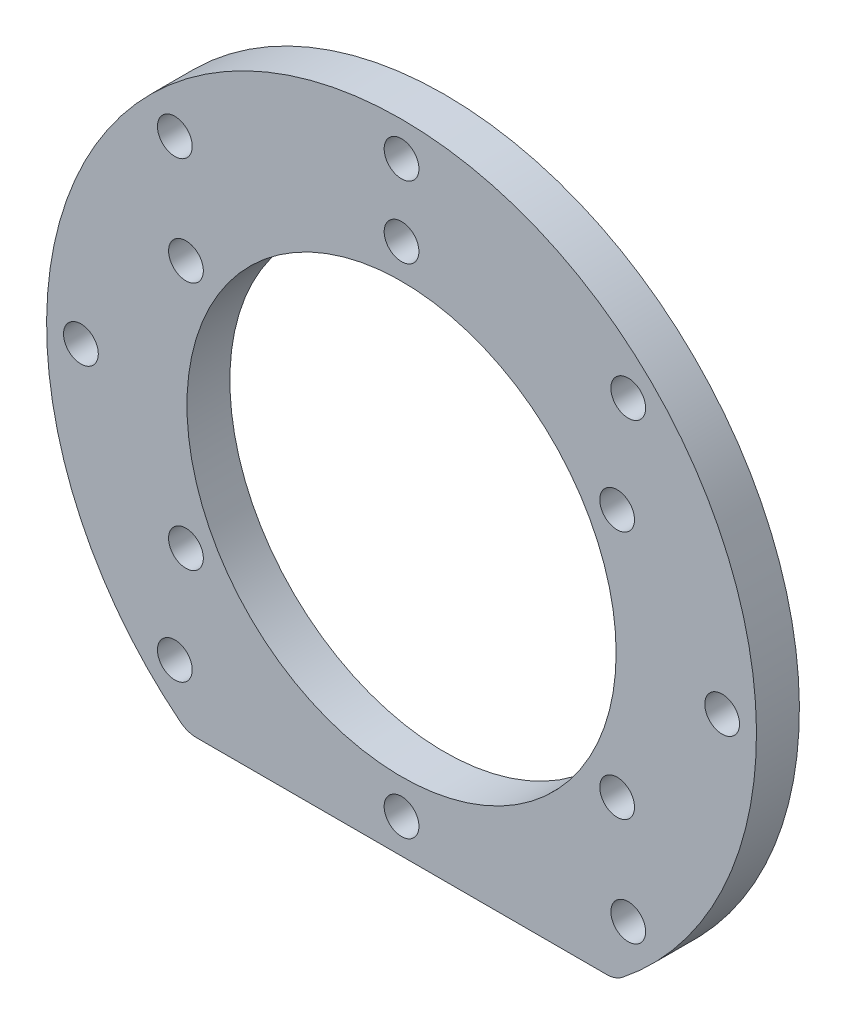
ISO-10303-21;
HEADER;
FILE_DESCRIPTION(('STEP AP214'),'2;1');
FILE_NAME('part.step','',(''),(''),'','','');
FILE_SCHEMA(('AUTOMOTIVE_DESIGN { 1 0 10303 214 1 1 1 1 }'));
ENDSEC;
DATA;
#1=APPLICATION_CONTEXT('core data for automotive mechanical design processes');
#2=APPLICATION_PROTOCOL_DEFINITION('international standard','automotive_design',2000,#1);
#3=PRODUCT_CONTEXT('',#1,'mechanical');
#4=PRODUCT('Part','Part','',(#3));
#5=PRODUCT_RELATED_PRODUCT_CATEGORY('part','',(#4));
#6=PRODUCT_DEFINITION_FORMATION('','',#4);
#7=PRODUCT_DEFINITION_CONTEXT('part definition',#1,'design');
#8=PRODUCT_DEFINITION('design','',#6,#7);
#9=PRODUCT_DEFINITION_SHAPE('','',#8);
#10=(LENGTH_UNIT() NAMED_UNIT(*) SI_UNIT(.MILLI.,.METRE.));
#11=(NAMED_UNIT(*) PLANE_ANGLE_UNIT() SI_UNIT($,.RADIAN.));
#12=(NAMED_UNIT(*) SI_UNIT($,.STERADIAN.) SOLID_ANGLE_UNIT());
#13=UNCERTAINTY_MEASURE_WITH_UNIT(LENGTH_MEASURE(1.E-05),#10,'distance_accuracy_value','');
#14=(GEOMETRIC_REPRESENTATION_CONTEXT(3) GLOBAL_UNCERTAINTY_ASSIGNED_CONTEXT((#13)) GLOBAL_UNIT_ASSIGNED_CONTEXT((#10,
#11,#12)) REPRESENTATION_CONTEXT('',''));
#15=CARTESIAN_POINT('',(0.,0.,0.));
#16=DIRECTION('',(0.,0.,1.));
#17=DIRECTION('',(1.,0.,0.));
#18=AXIS2_PLACEMENT_3D('',#15,#16,#17);
#19=CARTESIAN_POINT('',(0.,0.,5.));
#20=DIRECTION('',(0.,0.,1.));
#21=DIRECTION('',(1.,0.,0.));
#22=AXIS2_PLACEMENT_3D('',#19,#20,#21);
#23=PLANE('',#22);
#24=DIRECTION('',(-1.,0.,0.));
#25=VECTOR('',#24,1.);
#26=CARTESIAN_POINT('',(-24.9163099194082,-33.,5.));
#27=LINE('',#26,#25);
#28=CARTESIAN_POINT('',(23.8897990782677,-33.,5.));
#29=VERTEX_POINT('',#28);
#30=CARTESIAN_POINT('',(-23.8897990782677,-33.,5.));
#31=VERTEX_POINT('',#30);
#32=EDGE_CURVE('E90',#29,#31,#27,.T.);
#33=ORIENTED_EDGE('',*,*,#32,.F.);
#34=CARTESIAN_POINT('',(23.8897990782677,-30.,5.));
#35=DIRECTION('',(0.,0.,1.));
#36=DIRECTION('',(1.,0.,0.));
#37=AXIS2_PLACEMENT_3D('',#34,#35,#36);
#38=CIRCLE('',#37,3.);
#39=CARTESIAN_POINT('',(25.7586229957332,-32.3468057366362,5.));
#40=VERTEX_POINT('',#39);
#41=EDGE_CURVE('E75',#29,#40,#38,.T.);
#42=ORIENTED_EDGE('',*,*,#41,.T.);
#43=CARTESIAN_POINT('',(0.,0.,5.));
#44=DIRECTION('',(0.,0.,1.));
#45=DIRECTION('',(1.,0.,0.));
#46=AXIS2_PLACEMENT_3D('',#43,#44,#45);
#47=CIRCLE('',#46,41.35);
#48=CARTESIAN_POINT('',(-25.7586229957332,-32.3468057366362,5.));
#49=VERTEX_POINT('',#48);
#50=EDGE_CURVE('E184',#40,#49,#47,.T.);
#51=ORIENTED_EDGE('',*,*,#50,.T.);
#52=CARTESIAN_POINT('',(-23.8897990782677,-30.,5.));
#53=DIRECTION('',(0.,0.,1.));
#54=DIRECTION('',(1.,0.,0.));
#55=AXIS2_PLACEMENT_3D('',#52,#53,#54);
#56=CIRCLE('',#55,3.);
#57=EDGE_CURVE('E84',#49,#31,#56,.T.);
#58=ORIENTED_EDGE('',*,*,#57,.T.);
#59=EDGE_LOOP('',(#33,#42,#51,#58));
#60=FACE_BOUND('',#59,.T.);
#61=CARTESIAN_POINT('',(0.,37.35,5.));
#62=DIRECTION('',(0.,0.,1.));
#63=DIRECTION('',(1.,0.,0.));
#64=AXIS2_PLACEMENT_3D('',#61,#62,#63);
#65=CIRCLE('',#64,2.025);
#66=CARTESIAN_POINT('',(2.025,37.35,5.));
#67=VERTEX_POINT('',#66);
#68=EDGE_CURVE('E104',#67,#67,#65,.T.);
#69=ORIENTED_EDGE('',*,*,#68,.F.);
#70=EDGE_LOOP('',(#69));
#71=FACE_BOUND('',#70,.T.);
#72=CARTESIAN_POINT('',(26.4104382773176,26.4104382773176,5.));
#73=DIRECTION('',(0.,0.,1.));
#74=DIRECTION('',(1.,0.,0.));
#75=AXIS2_PLACEMENT_3D('',#72,#73,#74);
#76=CIRCLE('',#75,2.025);
#77=CARTESIAN_POINT('',(28.4354382773176,26.4104382773176,5.));
#78=VERTEX_POINT('',#77);
#79=EDGE_CURVE('E110',#78,#78,#76,.T.);
#80=ORIENTED_EDGE('',*,*,#79,.F.);
#81=EDGE_LOOP('',(#80));
#82=FACE_BOUND('',#81,.T.);
#83=CARTESIAN_POINT('',(37.35,0.,5.));
#84=DIRECTION('',(0.,0.,1.));
#85=DIRECTION('',(1.,0.,0.));
#86=AXIS2_PLACEMENT_3D('',#83,#84,#85);
#87=CIRCLE('',#86,2.025);
#88=CARTESIAN_POINT('',(39.375,0.,5.));
#89=VERTEX_POINT('',#88);
#90=EDGE_CURVE('E116',#89,#89,#87,.T.);
#91=ORIENTED_EDGE('',*,*,#90,.F.);
#92=EDGE_LOOP('',(#91));
#93=FACE_BOUND('',#92,.T.);
#94=CARTESIAN_POINT('',(26.4104382773176,-26.4104382773176,5.));
#95=DIRECTION('',(0.,0.,1.));
#96=DIRECTION('',(1.,0.,0.));
#97=AXIS2_PLACEMENT_3D('',#94,#95,#96);
#98=CIRCLE('',#97,2.025);
#99=CARTESIAN_POINT('',(28.4354382773176,-26.4104382773176,5.));
#100=VERTEX_POINT('',#99);
#101=EDGE_CURVE('E122',#100,#100,#98,.T.);
#102=ORIENTED_EDGE('',*,*,#101,.F.);
#103=EDGE_LOOP('',(#102));
#104=FACE_BOUND('',#103,.T.);
#105=CARTESIAN_POINT('',(-26.4104382773176,-26.4104382773176,5.));
#106=DIRECTION('',(0.,0.,1.));
#107=DIRECTION('',(1.,0.,0.));
#108=AXIS2_PLACEMENT_3D('',#105,#106,#107);
#109=CIRCLE('',#108,2.025);
#110=CARTESIAN_POINT('',(-24.3854382773176,-26.4104382773176,5.));
#111=VERTEX_POINT('',#110);
#112=EDGE_CURVE('E128',#111,#111,#109,.T.);
#113=ORIENTED_EDGE('',*,*,#112,.F.);
#114=EDGE_LOOP('',(#113));
#115=FACE_BOUND('',#114,.T.);
#116=CARTESIAN_POINT('',(-37.35,0.,5.));
#117=DIRECTION('',(0.,0.,1.));
#118=DIRECTION('',(1.,0.,0.));
#119=AXIS2_PLACEMENT_3D('',#116,#117,#118);
#120=CIRCLE('',#119,2.025);
#121=CARTESIAN_POINT('',(-35.325,0.,5.));
#122=VERTEX_POINT('',#121);
#123=EDGE_CURVE('E134',#122,#122,#120,.T.);
#124=ORIENTED_EDGE('',*,*,#123,.F.);
#125=EDGE_LOOP('',(#124));
#126=FACE_BOUND('',#125,.T.);
#127=CARTESIAN_POINT('',(-26.4104382773176,26.4104382773175,5.));
#128=DIRECTION('',(0.,0.,1.));
#129=DIRECTION('',(1.,0.,0.));
#130=AXIS2_PLACEMENT_3D('',#127,#128,#129);
#131=CIRCLE('',#130,2.025);
#132=CARTESIAN_POINT('',(-24.3854382773176,26.4104382773175,5.));
#133=VERTEX_POINT('',#132);
#134=EDGE_CURVE('E97',#133,#133,#131,.T.);
#135=ORIENTED_EDGE('',*,*,#134,.F.);
#136=EDGE_LOOP('',(#135));
#137=FACE_BOUND('',#136,.T.);
#138=CARTESIAN_POINT('',(-25.1147367097487,14.5,5.));
#139=DIRECTION('',(0.,0.,1.));
#140=DIRECTION('',(1.,0.,0.));
#141=AXIS2_PLACEMENT_3D('',#138,#139,#140);
#142=CIRCLE('',#141,2.025);
#143=CARTESIAN_POINT('',(-23.0897367097487,14.5,5.));
#144=VERTEX_POINT('',#143);
#145=EDGE_CURVE('E148',#144,#144,#142,.T.);
#146=ORIENTED_EDGE('',*,*,#145,.F.);
#147=EDGE_LOOP('',(#146));
#148=FACE_BOUND('',#147,.T.);
#149=CARTESIAN_POINT('',(0.,-29.,5.));
#150=DIRECTION('',(0.,0.,1.));
#151=DIRECTION('',(1.,0.,0.));
#152=AXIS2_PLACEMENT_3D('',#149,#150,#151);
#153=CIRCLE('',#152,2.025);
#154=CARTESIAN_POINT('',(2.025,-29.,5.));
#155=VERTEX_POINT('',#154);
#156=EDGE_CURVE('E160',#155,#155,#153,.T.);
#157=ORIENTED_EDGE('',*,*,#156,.F.);
#158=EDGE_LOOP('',(#157));
#159=FACE_BOUND('',#158,.T.);
#160=CARTESIAN_POINT('',(25.1147367097487,14.5,5.));
#161=DIRECTION('',(0.,0.,1.));
#162=DIRECTION('',(1.,0.,0.));
#163=AXIS2_PLACEMENT_3D('',#160,#161,#162);
#164=CIRCLE('',#163,2.025);
#165=CARTESIAN_POINT('',(27.1397367097487,14.5,5.));
#166=VERTEX_POINT('',#165);
#167=EDGE_CURVE('E172',#166,#166,#164,.T.);
#168=ORIENTED_EDGE('',*,*,#167,.F.);
#169=EDGE_LOOP('',(#168));
#170=FACE_BOUND('',#169,.T.);
#171=CARTESIAN_POINT('',(0.,29.,5.));
#172=DIRECTION('',(0.,0.,1.));
#173=DIRECTION('',(1.,0.,0.));
#174=AXIS2_PLACEMENT_3D('',#171,#172,#173);
#175=CIRCLE('',#174,2.025);
#176=CARTESIAN_POINT('',(2.025,29.,5.));
#177=VERTEX_POINT('',#176);
#178=EDGE_CURVE('E178',#177,#177,#175,.T.);
#179=ORIENTED_EDGE('',*,*,#178,.F.);
#180=EDGE_LOOP('',(#179));
#181=FACE_BOUND('',#180,.T.);
#182=CARTESIAN_POINT('',(25.1147367097487,-14.5,5.));
#183=DIRECTION('',(0.,0.,1.));
#184=DIRECTION('',(1.,0.,0.));
#185=AXIS2_PLACEMENT_3D('',#182,#183,#184);
#186=CIRCLE('',#185,2.025);
#187=CARTESIAN_POINT('',(27.1397367097487,-14.5,5.));
#188=VERTEX_POINT('',#187);
#189=EDGE_CURVE('E166',#188,#188,#186,.T.);
#190=ORIENTED_EDGE('',*,*,#189,.F.);
#191=EDGE_LOOP('',(#190));
#192=FACE_BOUND('',#191,.T.);
#193=CARTESIAN_POINT('',(-25.1147367097487,-14.5,5.));
#194=DIRECTION('',(0.,0.,1.));
#195=DIRECTION('',(1.,0.,0.));
#196=AXIS2_PLACEMENT_3D('',#193,#194,#195);
#197=CIRCLE('',#196,2.025);
#198=CARTESIAN_POINT('',(-23.0897367097487,-14.5,5.));
#199=VERTEX_POINT('',#198);
#200=EDGE_CURVE('E154',#199,#199,#197,.T.);
#201=ORIENTED_EDGE('',*,*,#200,.F.);
#202=EDGE_LOOP('',(#201));
#203=FACE_BOUND('',#202,.T.);
#204=CARTESIAN_POINT('',(0.,0.,5.));
#205=DIRECTION('',(0.,0.,1.));
#206=DIRECTION('',(1.,0.,0.));
#207=AXIS2_PLACEMENT_3D('',#204,#205,#206);
#208=CIRCLE('',#207,25.);
#209=CARTESIAN_POINT('',(25.,0.,5.));
#210=VERTEX_POINT('',#209);
#211=EDGE_CURVE('E142',#210,#210,#208,.T.);
#212=ORIENTED_EDGE('',*,*,#211,.F.);
#213=EDGE_LOOP('',(#212));
#214=FACE_BOUND('',#213,.T.);
#215=ADVANCED_FACE('F35',(#60,#71,#82,#93,#104,#115,#126,#137,#148,#159,#170,#181,#192,#203,
#214),#23,.T.);
#216=CARTESIAN_POINT('',(0.,0.,0.));
#217=DIRECTION('',(0.,0.,1.));
#218=DIRECTION('',(1.,0.,0.));
#219=AXIS2_PLACEMENT_3D('',#216,#217,#218);
#220=PLANE('',#219);
#221=CARTESIAN_POINT('',(0.,37.35,0.));
#222=DIRECTION('',(0.,0.,1.));
#223=DIRECTION('',(1.,0.,0.));
#224=AXIS2_PLACEMENT_3D('',#221,#222,#223);
#225=CIRCLE('',#224,2.025);
#226=CARTESIAN_POINT('',(2.025,37.35,0.));
#227=VERTEX_POINT('',#226);
#228=EDGE_CURVE('E100',#227,#227,#225,.T.);
#229=ORIENTED_EDGE('',*,*,#228,.T.);
#230=EDGE_LOOP('',(#229));
#231=FACE_BOUND('',#230,.T.);
#232=CARTESIAN_POINT('',(26.4104382773176,26.4104382773176,0.));
#233=DIRECTION('',(0.,0.,1.));
#234=DIRECTION('',(1.,0.,0.));
#235=AXIS2_PLACEMENT_3D('',#232,#233,#234);
#236=CIRCLE('',#235,2.025);
#237=CARTESIAN_POINT('',(28.4354382773176,26.4104382773176,0.));
#238=VERTEX_POINT('',#237);
#239=EDGE_CURVE('E107',#238,#238,#236,.T.);
#240=ORIENTED_EDGE('',*,*,#239,.T.);
#241=EDGE_LOOP('',(#240));
#242=FACE_BOUND('',#241,.T.);
#243=CARTESIAN_POINT('',(37.35,0.,0.));
#244=DIRECTION('',(0.,0.,1.));
#245=DIRECTION('',(1.,0.,0.));
#246=AXIS2_PLACEMENT_3D('',#243,#244,#245);
#247=CIRCLE('',#246,2.025);
#248=CARTESIAN_POINT('',(39.375,0.,0.));
#249=VERTEX_POINT('',#248);
#250=EDGE_CURVE('E113',#249,#249,#247,.T.);
#251=ORIENTED_EDGE('',*,*,#250,.T.);
#252=EDGE_LOOP('',(#251));
#253=FACE_BOUND('',#252,.T.);
#254=CARTESIAN_POINT('',(26.4104382773176,-26.4104382773176,0.));
#255=DIRECTION('',(0.,0.,1.));
#256=DIRECTION('',(1.,0.,0.));
#257=AXIS2_PLACEMENT_3D('',#254,#255,#256);
#258=CIRCLE('',#257,2.025);
#259=CARTESIAN_POINT('',(28.4354382773176,-26.4104382773176,0.));
#260=VERTEX_POINT('',#259);
#261=EDGE_CURVE('E119',#260,#260,#258,.T.);
#262=ORIENTED_EDGE('',*,*,#261,.T.);
#263=EDGE_LOOP('',(#262));
#264=FACE_BOUND('',#263,.T.);
#265=CARTESIAN_POINT('',(-26.4104382773176,-26.4104382773176,0.));
#266=DIRECTION('',(0.,0.,1.));
#267=DIRECTION('',(1.,0.,0.));
#268=AXIS2_PLACEMENT_3D('',#265,#266,#267);
#269=CIRCLE('',#268,2.025);
#270=CARTESIAN_POINT('',(-24.3854382773176,-26.4104382773176,0.));
#271=VERTEX_POINT('',#270);
#272=EDGE_CURVE('E125',#271,#271,#269,.T.);
#273=ORIENTED_EDGE('',*,*,#272,.T.);
#274=EDGE_LOOP('',(#273));
#275=FACE_BOUND('',#274,.T.);
#276=CARTESIAN_POINT('',(-37.35,0.,0.));
#277=DIRECTION('',(0.,0.,1.));
#278=DIRECTION('',(1.,0.,0.));
#279=AXIS2_PLACEMENT_3D('',#276,#277,#278);
#280=CIRCLE('',#279,2.025);
#281=CARTESIAN_POINT('',(-35.325,0.,0.));
#282=VERTEX_POINT('',#281);
#283=EDGE_CURVE('E131',#282,#282,#280,.T.);
#284=ORIENTED_EDGE('',*,*,#283,.T.);
#285=EDGE_LOOP('',(#284));
#286=FACE_BOUND('',#285,.T.);
#287=CARTESIAN_POINT('',(-26.4104382773176,26.4104382773175,0.));
#288=DIRECTION('',(0.,0.,1.));
#289=DIRECTION('',(1.,0.,0.));
#290=AXIS2_PLACEMENT_3D('',#287,#288,#289);
#291=CIRCLE('',#290,2.025);
#292=CARTESIAN_POINT('',(-24.3854382773176,26.4104382773175,0.));
#293=VERTEX_POINT('',#292);
#294=EDGE_CURVE('E137',#293,#293,#291,.T.);
#295=ORIENTED_EDGE('',*,*,#294,.T.);
#296=EDGE_LOOP('',(#295));
#297=FACE_BOUND('',#296,.T.);
#298=CARTESIAN_POINT('',(0.,0.,0.));
#299=DIRECTION('',(0.,0.,1.));
#300=DIRECTION('',(1.,0.,0.));
#301=AXIS2_PLACEMENT_3D('',#298,#299,#300);
#302=CIRCLE('',#301,41.35);
#303=CARTESIAN_POINT('',(25.7586229957332,-32.3468057366362,0.));
#304=VERTEX_POINT('',#303);
#305=CARTESIAN_POINT('',(-25.7586229957332,-32.3468057366362,0.));
#306=VERTEX_POINT('',#305);
#307=EDGE_CURVE('E181',#304,#306,#302,.T.);
#308=ORIENTED_EDGE('',*,*,#307,.F.);
#309=CARTESIAN_POINT('',(23.8897990782677,-30.,0.));
#310=DIRECTION('',(0.,0.,1.));
#311=DIRECTION('',(1.,0.,0.));
#312=AXIS2_PLACEMENT_3D('',#309,#310,#311);
#313=CIRCLE('',#312,3.);
#314=CARTESIAN_POINT('',(23.8897990782677,-33.,0.));
#315=VERTEX_POINT('',#314);
#316=EDGE_CURVE('E11',#304,#315,#313,.F.);
#317=ORIENTED_EDGE('',*,*,#316,.T.);
#318=DIRECTION('',(-1.,0.,0.));
#319=VECTOR('',#318,1.);
#320=CARTESIAN_POINT('',(-24.9163099194082,-33.,0.));
#321=LINE('',#320,#319);
#322=CARTESIAN_POINT('',(-23.8897990782677,-33.,0.));
#323=VERTEX_POINT('',#322);
#324=EDGE_CURVE('E92',#315,#323,#321,.T.);
#325=ORIENTED_EDGE('',*,*,#324,.T.);
#326=CARTESIAN_POINT('',(-23.8897990782677,-30.,0.));
#327=DIRECTION('',(0.,0.,1.));
#328=DIRECTION('',(1.,0.,0.));
#329=AXIS2_PLACEMENT_3D('',#326,#327,#328);
#330=CIRCLE('',#329,3.);
#331=EDGE_CURVE('E43',#323,#306,#330,.F.);
#332=ORIENTED_EDGE('',*,*,#331,.T.);
#333=EDGE_LOOP('',(#308,#317,#325,#332));
#334=FACE_BOUND('',#333,.T.);
#335=CARTESIAN_POINT('',(0.,29.,0.));
#336=DIRECTION('',(0.,0.,1.));
#337=DIRECTION('',(1.,0.,0.));
#338=AXIS2_PLACEMENT_3D('',#335,#336,#337);
#339=CIRCLE('',#338,2.025);
#340=CARTESIAN_POINT('',(2.025,29.,0.));
#341=VERTEX_POINT('',#340);
#342=EDGE_CURVE('E175',#341,#341,#339,.T.);
#343=ORIENTED_EDGE('',*,*,#342,.T.);
#344=EDGE_LOOP('',(#343));
#345=FACE_BOUND('',#344,.T.);
#346=CARTESIAN_POINT('',(25.1147367097487,14.5,0.));
#347=DIRECTION('',(0.,0.,1.));
#348=DIRECTION('',(1.,0.,0.));
#349=AXIS2_PLACEMENT_3D('',#346,#347,#348);
#350=CIRCLE('',#349,2.025);
#351=CARTESIAN_POINT('',(27.1397367097487,14.5,0.));
#352=VERTEX_POINT('',#351);
#353=EDGE_CURVE('E169',#352,#352,#350,.T.);
#354=ORIENTED_EDGE('',*,*,#353,.T.);
#355=EDGE_LOOP('',(#354));
#356=FACE_BOUND('',#355,.T.);
#357=CARTESIAN_POINT('',(25.1147367097487,-14.5,0.));
#358=DIRECTION('',(0.,0.,1.));
#359=DIRECTION('',(1.,0.,0.));
#360=AXIS2_PLACEMENT_3D('',#357,#358,#359);
#361=CIRCLE('',#360,2.025);
#362=CARTESIAN_POINT('',(27.1397367097487,-14.5,0.));
#363=VERTEX_POINT('',#362);
#364=EDGE_CURVE('E163',#363,#363,#361,.T.);
#365=ORIENTED_EDGE('',*,*,#364,.T.);
#366=EDGE_LOOP('',(#365));
#367=FACE_BOUND('',#366,.T.);
#368=CARTESIAN_POINT('',(0.,-29.,0.));
#369=DIRECTION('',(0.,0.,1.));
#370=DIRECTION('',(1.,0.,0.));
#371=AXIS2_PLACEMENT_3D('',#368,#369,#370);
#372=CIRCLE('',#371,2.025);
#373=CARTESIAN_POINT('',(2.025,-29.,0.));
#374=VERTEX_POINT('',#373);
#375=EDGE_CURVE('E157',#374,#374,#372,.T.);
#376=ORIENTED_EDGE('',*,*,#375,.T.);
#377=EDGE_LOOP('',(#376));
#378=FACE_BOUND('',#377,.T.);
#379=CARTESIAN_POINT('',(-25.1147367097487,-14.5,0.));
#380=DIRECTION('',(0.,0.,1.));
#381=DIRECTION('',(1.,0.,0.));
#382=AXIS2_PLACEMENT_3D('',#379,#380,#381);
#383=CIRCLE('',#382,2.025);
#384=CARTESIAN_POINT('',(-23.0897367097487,-14.5,0.));
#385=VERTEX_POINT('',#384);
#386=EDGE_CURVE('E151',#385,#385,#383,.T.);
#387=ORIENTED_EDGE('',*,*,#386,.T.);
#388=EDGE_LOOP('',(#387));
#389=FACE_BOUND('',#388,.T.);
#390=CARTESIAN_POINT('',(-25.1147367097487,14.5,0.));
#391=DIRECTION('',(0.,0.,1.));
#392=DIRECTION('',(1.,0.,0.));
#393=AXIS2_PLACEMENT_3D('',#390,#391,#392);
#394=CIRCLE('',#393,2.025);
#395=CARTESIAN_POINT('',(-23.0897367097487,14.5,0.));
#396=VERTEX_POINT('',#395);
#397=EDGE_CURVE('E145',#396,#396,#394,.T.);
#398=ORIENTED_EDGE('',*,*,#397,.T.);
#399=EDGE_LOOP('',(#398));
#400=FACE_BOUND('',#399,.T.);
#401=CARTESIAN_POINT('',(0.,0.,0.));
#402=DIRECTION('',(0.,0.,1.));
#403=DIRECTION('',(1.,0.,0.));
#404=AXIS2_PLACEMENT_3D('',#401,#402,#403);
#405=CIRCLE('',#404,25.);
#406=CARTESIAN_POINT('',(25.,0.,0.));
#407=VERTEX_POINT('',#406);
#408=EDGE_CURVE('E103',#407,#407,#405,.T.);
#409=ORIENTED_EDGE('',*,*,#408,.T.);
#410=EDGE_LOOP('',(#409));
#411=FACE_BOUND('',#410,.T.);
#412=ADVANCED_FACE('F194',(#231,#242,#253,#264,#275,#286,#297,#334,#345,#356,#367,#378,#389,
#400,#411),#220,.F.);
#413=CARTESIAN_POINT('',(0.,0.,5.));
#414=DIRECTION('',(0.,0.,-1.));
#415=DIRECTION('',(-1.,0.,0.));
#416=AXIS2_PLACEMENT_3D('',#413,#414,#415);
#417=CYLINDRICAL_SURFACE('',#416,41.35);
#418=ORIENTED_EDGE('',*,*,#50,.F.);
#419=DIRECTION('',(0.,0.,-1.));
#420=VECTOR('',#419,1.);
#421=CARTESIAN_POINT('',(25.7586229957332,-32.3468057366363,5.));
#422=LINE('',#421,#420);
#423=EDGE_CURVE('E56',#40,#304,#422,.T.);
#424=ORIENTED_EDGE('',*,*,#423,.T.);
#425=ORIENTED_EDGE('',*,*,#307,.T.);
#426=DIRECTION('',(0.,0.,-1.));
#427=VECTOR('',#426,1.);
#428=CARTESIAN_POINT('',(-25.7586229957332,-32.3468057366363,5.));
#429=LINE('',#428,#427);
#430=EDGE_CURVE('E83',#306,#49,#429,.F.);
#431=ORIENTED_EDGE('',*,*,#430,.T.);
#432=EDGE_LOOP('',(#418,#424,#425,#431));
#433=FACE_BOUND('',#432,.T.);
#434=ADVANCED_FACE('F192',(#433),#417,.T.);
#435=CARTESIAN_POINT('',(0.,29.,5.));
#436=DIRECTION('',(0.,0.,-1.));
#437=DIRECTION('',(-1.,0.,0.));
#438=AXIS2_PLACEMENT_3D('',#435,#436,#437);
#439=CYLINDRICAL_SURFACE('',#438,2.025);
#440=ORIENTED_EDGE('',*,*,#178,.T.);
#441=EDGE_LOOP('',(#440));
#442=FACE_BOUND('',#441,.T.);
#443=ORIENTED_EDGE('',*,*,#342,.F.);
#444=EDGE_LOOP('',(#443));
#445=FACE_BOUND('',#444,.T.);
#446=ADVANCED_FACE('F234',(#442,#445),#439,.F.);
#447=CARTESIAN_POINT('',(25.1147367097487,14.5,5.));
#448=DIRECTION('',(0.,0.,-1.));
#449=DIRECTION('',(-1.,0.,0.));
#450=AXIS2_PLACEMENT_3D('',#447,#448,#449);
#451=CYLINDRICAL_SURFACE('',#450,2.025);
#452=ORIENTED_EDGE('',*,*,#167,.T.);
#453=EDGE_LOOP('',(#452));
#454=FACE_BOUND('',#453,.T.);
#455=ORIENTED_EDGE('',*,*,#353,.F.);
#456=EDGE_LOOP('',(#455));
#457=FACE_BOUND('',#456,.T.);
#458=ADVANCED_FACE('F304',(#454,#457),#451,.F.);
#459=CARTESIAN_POINT('',(25.1147367097487,-14.5,5.));
#460=DIRECTION('',(0.,0.,-1.));
#461=DIRECTION('',(-1.,0.,0.));
#462=AXIS2_PLACEMENT_3D('',#459,#460,#461);
#463=CYLINDRICAL_SURFACE('',#462,2.025);
#464=ORIENTED_EDGE('',*,*,#189,.T.);
#465=EDGE_LOOP('',(#464));
#466=FACE_BOUND('',#465,.T.);
#467=ORIENTED_EDGE('',*,*,#364,.F.);
#468=EDGE_LOOP('',(#467));
#469=FACE_BOUND('',#468,.T.);
#470=ADVANCED_FACE('F299',(#466,#469),#463,.F.);
#471=CARTESIAN_POINT('',(0.,-29.,5.));
#472=DIRECTION('',(0.,0.,-1.));
#473=DIRECTION('',(-1.,0.,0.));
#474=AXIS2_PLACEMENT_3D('',#471,#472,#473);
#475=CYLINDRICAL_SURFACE('',#474,2.025);
#476=ORIENTED_EDGE('',*,*,#156,.T.);
#477=EDGE_LOOP('',(#476));
#478=FACE_BOUND('',#477,.T.);
#479=ORIENTED_EDGE('',*,*,#375,.F.);
#480=EDGE_LOOP('',(#479));
#481=FACE_BOUND('',#480,.T.);
#482=ADVANCED_FACE('F294',(#478,#481),#475,.F.);
#483=CARTESIAN_POINT('',(-25.1147367097487,-14.5,5.));
#484=DIRECTION('',(0.,0.,-1.));
#485=DIRECTION('',(-1.,0.,0.));
#486=AXIS2_PLACEMENT_3D('',#483,#484,#485);
#487=CYLINDRICAL_SURFACE('',#486,2.025);
#488=ORIENTED_EDGE('',*,*,#200,.T.);
#489=EDGE_LOOP('',(#488));
#490=FACE_BOUND('',#489,.T.);
#491=ORIENTED_EDGE('',*,*,#386,.F.);
#492=EDGE_LOOP('',(#491));
#493=FACE_BOUND('',#492,.T.);
#494=ADVANCED_FACE('F226',(#490,#493),#487,.F.);
#495=CARTESIAN_POINT('',(-25.1147367097487,14.5,5.));
#496=DIRECTION('',(0.,0.,-1.));
#497=DIRECTION('',(-1.,0.,0.));
#498=AXIS2_PLACEMENT_3D('',#495,#496,#497);
#499=CYLINDRICAL_SURFACE('',#498,2.025);
#500=ORIENTED_EDGE('',*,*,#145,.T.);
#501=EDGE_LOOP('',(#500));
#502=FACE_BOUND('',#501,.T.);
#503=ORIENTED_EDGE('',*,*,#397,.F.);
#504=EDGE_LOOP('',(#503));
#505=FACE_BOUND('',#504,.T.);
#506=ADVANCED_FACE('F216',(#502,#505),#499,.F.);
#507=CARTESIAN_POINT('',(0.,0.,5.));
#508=DIRECTION('',(0.,0.,-1.));
#509=DIRECTION('',(-1.,0.,0.));
#510=AXIS2_PLACEMENT_3D('',#507,#508,#509);
#511=CYLINDRICAL_SURFACE('',#510,25.);
#512=ORIENTED_EDGE('',*,*,#211,.T.);
#513=EDGE_LOOP('',(#512));
#514=FACE_BOUND('',#513,.T.);
#515=ORIENTED_EDGE('',*,*,#408,.F.);
#516=EDGE_LOOP('',(#515));
#517=FACE_BOUND('',#516,.T.);
#518=ADVANCED_FACE('F213',(#514,#517),#511,.F.);
#519=CARTESIAN_POINT('',(-26.4104382773176,26.4104382773175,0.));
#520=DIRECTION('',(0.,0.,1.));
#521=DIRECTION('',(1.,0.,0.));
#522=AXIS2_PLACEMENT_3D('',#519,#520,#521);
#523=CYLINDRICAL_SURFACE('',#522,2.025);
#524=ORIENTED_EDGE('',*,*,#294,.F.);
#525=EDGE_LOOP('',(#524));
#526=FACE_BOUND('',#525,.T.);
#527=ORIENTED_EDGE('',*,*,#134,.T.);
#528=EDGE_LOOP('',(#527));
#529=FACE_BOUND('',#528,.T.);
#530=ADVANCED_FACE('F215',(#526,#529),#523,.F.);
#531=CARTESIAN_POINT('',(-37.35,0.,0.));
#532=DIRECTION('',(0.,0.,1.));
#533=DIRECTION('',(1.,0.,0.));
#534=AXIS2_PLACEMENT_3D('',#531,#532,#533);
#535=CYLINDRICAL_SURFACE('',#534,2.025);
#536=ORIENTED_EDGE('',*,*,#283,.F.);
#537=EDGE_LOOP('',(#536));
#538=FACE_BOUND('',#537,.T.);
#539=ORIENTED_EDGE('',*,*,#123,.T.);
#540=EDGE_LOOP('',(#539));
#541=FACE_BOUND('',#540,.T.);
#542=ADVANCED_FACE('F223',(#538,#541),#535,.F.);
#543=CARTESIAN_POINT('',(-26.4104382773176,-26.4104382773176,0.));
#544=DIRECTION('',(0.,0.,1.));
#545=DIRECTION('',(1.,0.,0.));
#546=AXIS2_PLACEMENT_3D('',#543,#544,#545);
#547=CYLINDRICAL_SURFACE('',#546,2.025);
#548=ORIENTED_EDGE('',*,*,#272,.F.);
#549=EDGE_LOOP('',(#548));
#550=FACE_BOUND('',#549,.T.);
#551=ORIENTED_EDGE('',*,*,#112,.T.);
#552=EDGE_LOOP('',(#551));
#553=FACE_BOUND('',#552,.T.);
#554=ADVANCED_FACE('F262',(#550,#553),#547,.F.);
#555=CARTESIAN_POINT('',(26.4104382773176,-26.4104382773176,0.));
#556=DIRECTION('',(0.,0.,1.));
#557=DIRECTION('',(1.,0.,0.));
#558=AXIS2_PLACEMENT_3D('',#555,#556,#557);
#559=CYLINDRICAL_SURFACE('',#558,2.025);
#560=ORIENTED_EDGE('',*,*,#261,.F.);
#561=EDGE_LOOP('',(#560));
#562=FACE_BOUND('',#561,.T.);
#563=ORIENTED_EDGE('',*,*,#101,.T.);
#564=EDGE_LOOP('',(#563));
#565=FACE_BOUND('',#564,.T.);
#566=ADVANCED_FACE('F258',(#562,#565),#559,.F.);
#567=CARTESIAN_POINT('',(37.35,0.,0.));
#568=DIRECTION('',(0.,0.,1.));
#569=DIRECTION('',(1.,0.,0.));
#570=AXIS2_PLACEMENT_3D('',#567,#568,#569);
#571=CYLINDRICAL_SURFACE('',#570,2.025);
#572=ORIENTED_EDGE('',*,*,#250,.F.);
#573=EDGE_LOOP('',(#572));
#574=FACE_BOUND('',#573,.T.);
#575=ORIENTED_EDGE('',*,*,#90,.T.);
#576=EDGE_LOOP('',(#575));
#577=FACE_BOUND('',#576,.T.);
#578=ADVANCED_FACE('F254',(#574,#577),#571,.F.);
#579=CARTESIAN_POINT('',(26.4104382773176,26.4104382773176,0.));
#580=DIRECTION('',(0.,0.,1.));
#581=DIRECTION('',(1.,0.,0.));
#582=AXIS2_PLACEMENT_3D('',#579,#580,#581);
#583=CYLINDRICAL_SURFACE('',#582,2.025);
#584=ORIENTED_EDGE('',*,*,#239,.F.);
#585=EDGE_LOOP('',(#584));
#586=FACE_BOUND('',#585,.T.);
#587=ORIENTED_EDGE('',*,*,#79,.T.);
#588=EDGE_LOOP('',(#587));
#589=FACE_BOUND('',#588,.T.);
#590=ADVANCED_FACE('F248',(#586,#589),#583,.F.);
#591=CARTESIAN_POINT('',(0.,37.35,0.));
#592=DIRECTION('',(0.,0.,1.));
#593=DIRECTION('',(1.,0.,0.));
#594=AXIS2_PLACEMENT_3D('',#591,#592,#593);
#595=CYLINDRICAL_SURFACE('',#594,2.025);
#596=ORIENTED_EDGE('',*,*,#228,.F.);
#597=EDGE_LOOP('',(#596));
#598=FACE_BOUND('',#597,.T.);
#599=ORIENTED_EDGE('',*,*,#68,.T.);
#600=EDGE_LOOP('',(#599));
#601=FACE_BOUND('',#600,.T.);
#602=ADVANCED_FACE('F243',(#598,#601),#595,.F.);
#603=CARTESIAN_POINT('',(-24.9163099194082,-33.,0.));
#604=DIRECTION('',(0.,1.,0.));
#605=DIRECTION('',(0.,0.,1.));
#606=AXIS2_PLACEMENT_3D('',#603,#604,#605);
#607=PLANE('',#606);
#608=ORIENTED_EDGE('',*,*,#324,.F.);
#609=DIRECTION('',(0.,0.,-1.));
#610=VECTOR('',#609,1.);
#611=CARTESIAN_POINT('',(23.8897990782677,-33.,0.));
#612=LINE('',#611,#610);
#613=EDGE_CURVE('E79',#315,#29,#612,.F.);
#614=ORIENTED_EDGE('',*,*,#613,.T.);
#615=ORIENTED_EDGE('',*,*,#32,.T.);
#616=DIRECTION('',(0.,0.,-1.));
#617=VECTOR('',#616,1.);
#618=CARTESIAN_POINT('',(-23.8897990782677,-33.,0.));
#619=LINE('',#618,#617);
#620=EDGE_CURVE('E93',#31,#323,#619,.T.);
#621=ORIENTED_EDGE('',*,*,#620,.T.);
#622=EDGE_LOOP('',(#608,#614,#615,#621));
#623=FACE_BOUND('',#622,.T.);
#624=ADVANCED_FACE('F89',(#623),#607,.F.);
#625=CARTESIAN_POINT('',(23.8897990782677,-30.,5.));
#626=DIRECTION('',(0.,0.,-1.));
#627=DIRECTION('',(-1.,0.,0.));
#628=AXIS2_PLACEMENT_3D('',#625,#626,#627);
#629=CYLINDRICAL_SURFACE('',#628,3.);
#630=ORIENTED_EDGE('',*,*,#316,.F.);
#631=ORIENTED_EDGE('',*,*,#423,.F.);
#632=ORIENTED_EDGE('',*,*,#41,.F.);
#633=ORIENTED_EDGE('',*,*,#613,.F.);
#634=EDGE_LOOP('',(#630,#631,#632,#633));
#635=FACE_BOUND('',#634,.T.);
#636=ADVANCED_FACE('F78',(#635),#629,.T.);
#637=CARTESIAN_POINT('',(-23.8897990782677,-30.,5.));
#638=DIRECTION('',(0.,0.,-1.));
#639=DIRECTION('',(-1.,0.,0.));
#640=AXIS2_PLACEMENT_3D('',#637,#638,#639);
#641=CYLINDRICAL_SURFACE('',#640,3.);
#642=ORIENTED_EDGE('',*,*,#331,.F.);
#643=ORIENTED_EDGE('',*,*,#620,.F.);
#644=ORIENTED_EDGE('',*,*,#57,.F.);
#645=ORIENTED_EDGE('',*,*,#430,.F.);
#646=EDGE_LOOP('',(#642,#643,#644,#645));
#647=FACE_BOUND('',#646,.T.);
#648=ADVANCED_FACE('F37',(#647),#641,.T.);
#649=CLOSED_SHELL('',(#215,#412,#434,#446,#458,#470,#482,#494,#506,#518,#530,#542,#554,#566,
#578,#590,#602,#624,#636,#648));
#650=MANIFOLD_SOLID_BREP('B2',#649);
#651=ADVANCED_BREP_SHAPE_REPRESENTATION('',(#18,#650),#14);
#652=SHAPE_DEFINITION_REPRESENTATION(#9,#651);
ENDSEC;
END-ISO-10303-21;
